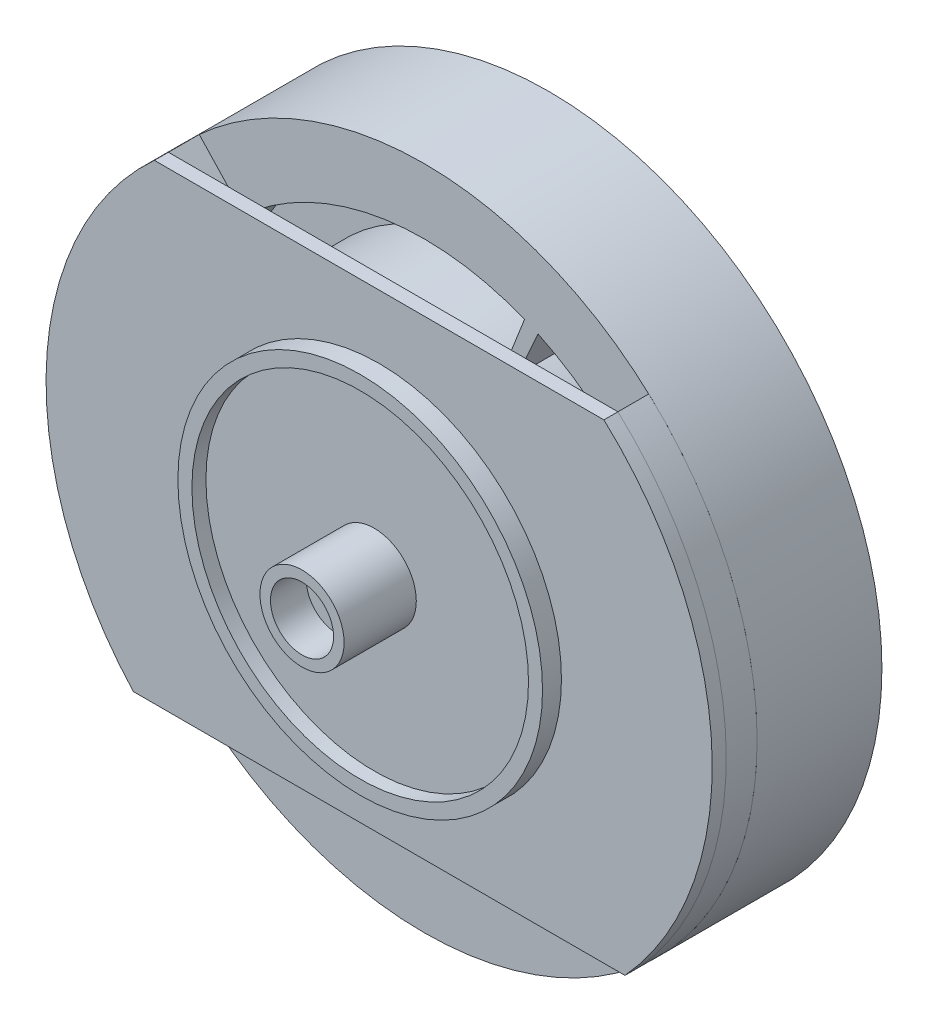
ISO-10303-21;
HEADER;
FILE_DESCRIPTION(('STEP AP214'),'2;1');
FILE_NAME('part.step','',(''),(''),'','','');
FILE_SCHEMA(('AUTOMOTIVE_DESIGN { 1 0 10303 214 1 1 1 1 }'));
ENDSEC;
DATA;
#1=APPLICATION_CONTEXT('core data for automotive mechanical design processes');
#2=APPLICATION_PROTOCOL_DEFINITION('international standard','automotive_design',2000,#1);
#3=PRODUCT_CONTEXT('',#1,'mechanical');
#4=PRODUCT('Part','Part','',(#3));
#5=PRODUCT_RELATED_PRODUCT_CATEGORY('part','',(#4));
#6=PRODUCT_DEFINITION_FORMATION('','',#4);
#7=PRODUCT_DEFINITION_CONTEXT('part definition',#1,'design');
#8=PRODUCT_DEFINITION('design','',#6,#7);
#9=PRODUCT_DEFINITION_SHAPE('','',#8);
#10=(LENGTH_UNIT() NAMED_UNIT(*) SI_UNIT(.MILLI.,.METRE.));
#11=(NAMED_UNIT(*) PLANE_ANGLE_UNIT() SI_UNIT($,.RADIAN.));
#12=(NAMED_UNIT(*) SI_UNIT($,.STERADIAN.) SOLID_ANGLE_UNIT());
#13=UNCERTAINTY_MEASURE_WITH_UNIT(LENGTH_MEASURE(1.E-05),#10,'distance_accuracy_value','');
#14=(GEOMETRIC_REPRESENTATION_CONTEXT(3) GLOBAL_UNCERTAINTY_ASSIGNED_CONTEXT((#13)) GLOBAL_UNIT_ASSIGNED_CONTEXT((#10,
#11,#12)) REPRESENTATION_CONTEXT('',''));
#15=CARTESIAN_POINT('',(0.,0.,0.));
#16=DIRECTION('',(0.,0.,1.));
#17=DIRECTION('',(1.,0.,0.));
#18=AXIS2_PLACEMENT_3D('',#15,#16,#17);
#19=CARTESIAN_POINT('',(-3.82843024285123,2.76033441316249,12.2448799994286));
#20=DIRECTION('',(0.,0.,-1.));
#21=DIRECTION('',(-1.,0.,0.));
#22=AXIS2_PLACEMENT_3D('',#19,#20,#21);
#23=CYLINDRICAL_SURFACE('',#22,23.75);
#24=CARTESIAN_POINT('',(-3.82843024285123,2.76033441316249,11.2448799994286));
#25=DIRECTION('',(0.,0.,1.));
#26=DIRECTION('',(1.,0.,0.));
#27=AXIS2_PLACEMENT_3D('',#24,#25,#26);
#28=CIRCLE('',#27,23.75);
#29=CARTESIAN_POINT('',(-19.8553375945632,20.2874773845552,11.2448799994286));
#30=VERTEX_POINT('',#29);
#31=CARTESIAN_POINT('',(-21.355573214244,-13.2665729385494,11.2448799994286));
#32=VERTEX_POINT('',#31);
#33=EDGE_CURVE('E119',#30,#32,#28,.T.);
#34=ORIENTED_EDGE('',*,*,#33,.T.);
#35=DIRECTION('',(0.,0.,-1.));
#36=VECTOR('',#35,1.);
#37=CARTESIAN_POINT('',(-21.355573214244,-13.2665729385494,12.2448799994286));
#38=LINE('',#37,#36);
#39=CARTESIAN_POINT('',(-21.355573214244,-13.2665729385494,12.2448799994286));
#40=VERTEX_POINT('',#39);
#41=EDGE_CURVE('E12',#40,#32,#38,.T.);
#42=ORIENTED_EDGE('',*,*,#41,.F.);
#43=CARTESIAN_POINT('',(-3.82843024285123,2.76033441316249,12.2448799994286));
#44=DIRECTION('',(0.,0.,1.));
#45=DIRECTION('',(1.,0.,0.));
#46=AXIS2_PLACEMENT_3D('',#43,#44,#45);
#47=CIRCLE('',#46,23.75);
#48=CARTESIAN_POINT('',(-19.8553375945632,20.2874773845552,12.2448799994286));
#49=VERTEX_POINT('',#48);
#50=EDGE_CURVE('E106',#49,#40,#47,.T.);
#51=ORIENTED_EDGE('',*,*,#50,.F.);
#52=DIRECTION('',(0.,0.,-1.));
#53=VECTOR('',#52,1.);
#54=CARTESIAN_POINT('',(-19.8553375945632,20.2874773845552,12.2448799994286));
#55=LINE('',#54,#53);
#56=EDGE_CURVE('E115',#49,#30,#55,.T.);
#57=ORIENTED_EDGE('',*,*,#56,.T.);
#58=EDGE_LOOP('',(#34,#42,#51,#57));
#59=FACE_BOUND('',#58,.T.);
#60=ADVANCED_FACE('F54',(#59),#23,.T.);
#61=CARTESIAN_POINT('',(-21.355573214244,-13.2665729385494,12.2448799994286));
#62=DIRECTION('',(0.,1.,0.));
#63=DIRECTION('',(0.,0.,1.));
#64=AXIS2_PLACEMENT_3D('',#61,#62,#63);
#65=PLANE('',#64);
#66=DIRECTION('',(1.,0.,0.));
#67=VECTOR('',#66,1.);
#68=CARTESIAN_POINT('',(-21.355573214244,-13.2665729385494,11.2448799994286));
#69=LINE('',#68,#67);
#70=CARTESIAN_POINT('',(13.6987127285415,-13.2665729385494,11.2448799994286));
#71=VERTEX_POINT('',#70);
#72=EDGE_CURVE('E110',#32,#71,#69,.T.);
#73=ORIENTED_EDGE('',*,*,#72,.T.);
#74=DIRECTION('',(0.,0.,-1.));
#75=VECTOR('',#74,1.);
#76=CARTESIAN_POINT('',(13.6987127285415,-13.2665729385494,12.2448799994286));
#77=LINE('',#76,#75);
#78=CARTESIAN_POINT('',(13.6987127285415,-13.2665729385494,12.2448799994286));
#79=VERTEX_POINT('',#78);
#80=EDGE_CURVE('E63',#79,#71,#77,.T.);
#81=ORIENTED_EDGE('',*,*,#80,.F.);
#82=DIRECTION('',(1.,0.,0.));
#83=VECTOR('',#82,1.);
#84=CARTESIAN_POINT('',(-21.355573214244,-13.2665729385494,12.2448799994286));
#85=LINE('',#84,#83);
#86=EDGE_CURVE('E101',#40,#79,#85,.T.);
#87=ORIENTED_EDGE('',*,*,#86,.F.);
#88=ORIENTED_EDGE('',*,*,#41,.T.);
#89=EDGE_LOOP('',(#73,#81,#87,#88));
#90=FACE_BOUND('',#89,.T.);
#91=ADVANCED_FACE('F109',(#90),#65,.F.);
#92=CARTESIAN_POINT('',(-3.82843024285123,2.76033441316249,12.2448799994286));
#93=DIRECTION('',(0.,0.,-1.));
#94=DIRECTION('',(-1.,0.,0.));
#95=AXIS2_PLACEMENT_3D('',#92,#93,#94);
#96=CYLINDRICAL_SURFACE('',#95,23.75);
#97=CARTESIAN_POINT('',(-3.82843024285123,2.76033441316249,11.2448799994286));
#98=DIRECTION('',(0.,0.,1.));
#99=DIRECTION('',(-1.,0.,0.));
#100=AXIS2_PLACEMENT_3D('',#97,#98,#99);
#101=CIRCLE('',#100,23.75);
#102=CARTESIAN_POINT('',(12.1984771088607,20.2874773845552,11.2448799994286));
#103=VERTEX_POINT('',#102);
#104=EDGE_CURVE('E88',#71,#103,#101,.T.);
#105=ORIENTED_EDGE('',*,*,#104,.T.);
#106=DIRECTION('',(0.,0.,-1.));
#107=VECTOR('',#106,1.);
#108=CARTESIAN_POINT('',(12.1984771088607,20.2874773845552,12.2448799994286));
#109=LINE('',#108,#107);
#110=CARTESIAN_POINT('',(12.1984771088607,20.2874773845552,12.2448799994286));
#111=VERTEX_POINT('',#110);
#112=EDGE_CURVE('E111',#111,#103,#109,.T.);
#113=ORIENTED_EDGE('',*,*,#112,.F.);
#114=CARTESIAN_POINT('',(-3.82843024285123,2.76033441316249,12.2448799994286));
#115=DIRECTION('',(0.,0.,1.));
#116=DIRECTION('',(-1.,0.,0.));
#117=AXIS2_PLACEMENT_3D('',#114,#115,#116);
#118=CIRCLE('',#117,23.75);
#119=EDGE_CURVE('E104',#79,#111,#118,.T.);
#120=ORIENTED_EDGE('',*,*,#119,.F.);
#121=ORIENTED_EDGE('',*,*,#80,.T.);
#122=EDGE_LOOP('',(#105,#113,#120,#121));
#123=FACE_BOUND('',#122,.T.);
#124=ADVANCED_FACE('F113',(#123),#96,.T.);
#125=CARTESIAN_POINT('',(-19.8553375945632,20.2874773845552,12.2448799994286));
#126=DIRECTION('',(0.,-1.,0.));
#127=DIRECTION('',(0.,0.,-1.));
#128=AXIS2_PLACEMENT_3D('',#125,#126,#127);
#129=PLANE('',#128);
#130=DIRECTION('',(-1.,0.,0.));
#131=VECTOR('',#130,1.);
#132=CARTESIAN_POINT('',(-19.8553375945632,20.2874773845552,11.2448799994286));
#133=LINE('',#132,#131);
#134=EDGE_CURVE('E94',#103,#30,#133,.T.);
#135=ORIENTED_EDGE('',*,*,#134,.T.);
#136=ORIENTED_EDGE('',*,*,#56,.F.);
#137=DIRECTION('',(-1.,0.,0.));
#138=VECTOR('',#137,1.);
#139=CARTESIAN_POINT('',(-19.8553375945632,20.2874773845552,12.2448799994286));
#140=LINE('',#139,#138);
#141=EDGE_CURVE('E71',#111,#49,#140,.T.);
#142=ORIENTED_EDGE('',*,*,#141,.F.);
#143=ORIENTED_EDGE('',*,*,#112,.T.);
#144=EDGE_LOOP('',(#135,#136,#142,#143));
#145=FACE_BOUND('',#144,.T.);
#146=ADVANCED_FACE('F127',(#145),#129,.F.);
#147=CARTESIAN_POINT('',(-3.82843024285123,2.76033441316249,12.2448799994286));
#148=DIRECTION('',(0.,0.,1.));
#149=DIRECTION('',(1.,0.,0.));
#150=AXIS2_PLACEMENT_3D('',#147,#148,#149);
#151=PLANE('',#150);
#152=CARTESIAN_POINT('',(-3.82843024285123,2.76033441316249,12.2448799994286));
#153=DIRECTION('',(0.,0.,1.));
#154=DIRECTION('',(1.,0.,0.));
#155=AXIS2_PLACEMENT_3D('',#152,#153,#154);
#156=CIRCLE('',#155,13.);
#157=CARTESIAN_POINT('',(-16.8284302428512,2.76033441316249,12.2448799994286));
#158=VERTEX_POINT('',#157);
#159=EDGE_CURVE('E135',#158,#158,#156,.T.);
#160=ORIENTED_EDGE('',*,*,#159,.F.);
#161=EDGE_LOOP('',(#160));
#162=FACE_BOUND('',#161,.T.);
#163=ORIENTED_EDGE('',*,*,#50,.T.);
#164=ORIENTED_EDGE('',*,*,#86,.T.);
#165=ORIENTED_EDGE('',*,*,#119,.T.);
#166=ORIENTED_EDGE('',*,*,#141,.T.);
#167=EDGE_LOOP('',(#163,#164,#165,#166));
#168=FACE_BOUND('',#167,.T.);
#169=ADVANCED_FACE('F102',(#162,#168),#151,.T.);
#170=CARTESIAN_POINT('',(-3.82843024285123,2.76033441316249,11.2448799994286));
#171=DIRECTION('',(0.,0.,1.));
#172=DIRECTION('',(1.,0.,0.));
#173=AXIS2_PLACEMENT_3D('',#170,#171,#172);
#174=PLANE('',#173);
#175=ORIENTED_EDGE('',*,*,#33,.F.);
#176=ORIENTED_EDGE('',*,*,#134,.F.);
#177=ORIENTED_EDGE('',*,*,#104,.F.);
#178=ORIENTED_EDGE('',*,*,#72,.F.);
#179=EDGE_LOOP('',(#175,#176,#177,#178));
#180=FACE_BOUND('',#179,.T.);
#181=ADVANCED_FACE('F130',(#180),#174,.F.);
#182=CARTESIAN_POINT('',(-3.82843024285123,2.76033441316249,13.5948799994286));
#183=DIRECTION('',(0.,0.,-1.));
#184=DIRECTION('',(-1.,0.,0.));
#185=AXIS2_PLACEMENT_3D('',#182,#183,#184);
#186=CYLINDRICAL_SURFACE('',#185,13.);
#187=CARTESIAN_POINT('',(-3.82843024285123,2.76033441316249,13.5948799994286));
#188=DIRECTION('',(0.,0.,1.));
#189=DIRECTION('',(1.,0.,0.));
#190=AXIS2_PLACEMENT_3D('',#187,#188,#189);
#191=CIRCLE('',#190,13.);
#192=CARTESIAN_POINT('',(-16.8284302428512,2.76033441316249,13.5948799994286));
#193=VERTEX_POINT('',#192);
#194=EDGE_CURVE('E138',#193,#193,#191,.T.);
#195=CARTESIAN_POINT('',(-16.8284302428512,2.76033441316249,13.5948799994286));
#196=CARTESIAN_POINT('',(-16.8284302428512,2.76033441316249,13.5808174994286));
#197=CARTESIAN_POINT('',(-16.8284302428512,2.76033441316249,13.5667549994286));
#198=CARTESIAN_POINT('',(-16.8284302428512,2.76033441316249,13.5386299994286));
#199=CARTESIAN_POINT('',(-16.8284302428512,2.76033441316249,13.5245674994286));
#200=CARTESIAN_POINT('',(-16.8284302428512,2.76033441316249,13.4964424994286));
#201=CARTESIAN_POINT('',(-16.8284302428512,2.76033441316249,13.4823799994286));
#202=CARTESIAN_POINT('',(-16.8284302428512,2.76033441316249,13.4542549994286));
#203=CARTESIAN_POINT('',(-16.8284302428512,2.76033441316249,13.4401924994286));
#204=CARTESIAN_POINT('',(-16.8284302428512,2.76033441316249,13.4120674994286));
#205=CARTESIAN_POINT('',(-16.8284302428512,2.76033441316249,13.3980049994286));
#206=CARTESIAN_POINT('',(-16.8284302428512,2.76033441316249,13.3698799994286));
#207=CARTESIAN_POINT('',(-16.8284302428512,2.76033441316249,13.3558174994286));
#208=CARTESIAN_POINT('',(-16.8284302428512,2.76033441316249,13.3276924994286));
#209=CARTESIAN_POINT('',(-16.8284302428512,2.76033441316249,13.3136299994286));
#210=CARTESIAN_POINT('',(-16.8284302428512,2.76033441316249,13.2855049994286));
#211=CARTESIAN_POINT('',(-16.8284302428512,2.76033441316249,13.2714424994286));
#212=CARTESIAN_POINT('',(-16.8284302428512,2.76033441316249,13.2433174994286));
#213=CARTESIAN_POINT('',(-16.8284302428512,2.76033441316249,13.2292549994286));
#214=CARTESIAN_POINT('',(-16.8284302428512,2.76033441316249,13.2011299994286));
#215=CARTESIAN_POINT('',(-16.8284302428512,2.76033441316249,13.1870674994286));
#216=CARTESIAN_POINT('',(-16.8284302428512,2.76033441316249,13.1589424994286));
#217=CARTESIAN_POINT('',(-16.8284302428512,2.76033441316249,13.1448799994286));
#218=CARTESIAN_POINT('',(-16.8284302428512,2.76033441316249,13.1167549994286));
#219=CARTESIAN_POINT('',(-16.8284302428512,2.76033441316249,13.1026924994286));
#220=CARTESIAN_POINT('',(-16.8284302428512,2.76033441316249,13.0745674994286));
#221=CARTESIAN_POINT('',(-16.8284302428512,2.76033441316249,13.0605049994286));
#222=CARTESIAN_POINT('',(-16.8284302428512,2.76033441316249,13.0323799994286));
#223=CARTESIAN_POINT('',(-16.8284302428512,2.76033441316249,13.0183174994286));
#224=CARTESIAN_POINT('',(-16.8284302428512,2.76033441316249,12.9901924994286));
#225=CARTESIAN_POINT('',(-16.8284302428512,2.76033441316249,12.9761299994286));
#226=CARTESIAN_POINT('',(-16.8284302428512,2.76033441316249,12.9480049994286));
#227=CARTESIAN_POINT('',(-16.8284302428512,2.76033441316249,12.9339424994286));
#228=CARTESIAN_POINT('',(-16.8284302428512,2.76033441316249,12.9058174994286));
#229=CARTESIAN_POINT('',(-16.8284302428512,2.76033441316249,12.8917549994286));
#230=CARTESIAN_POINT('',(-16.8284302428512,2.76033441316249,12.8636299994286));
#231=CARTESIAN_POINT('',(-16.8284302428512,2.76033441316249,12.8495674994286));
#232=CARTESIAN_POINT('',(-16.8284302428512,2.76033441316249,12.8214424994286));
#233=CARTESIAN_POINT('',(-16.8284302428512,2.76033441316249,12.8073799994286));
#234=CARTESIAN_POINT('',(-16.8284302428512,2.76033441316249,12.7792549994286));
#235=CARTESIAN_POINT('',(-16.8284302428512,2.76033441316249,12.7651924994286));
#236=CARTESIAN_POINT('',(-16.8284302428512,2.76033441316249,12.7370674994286));
#237=CARTESIAN_POINT('',(-16.8284302428512,2.76033441316249,12.7230049994286));
#238=CARTESIAN_POINT('',(-16.8284302428512,2.76033441316249,12.6948799994286));
#239=CARTESIAN_POINT('',(-16.8284302428512,2.76033441316249,12.6808174994286));
#240=CARTESIAN_POINT('',(-16.8284302428512,2.76033441316249,12.6526924994286));
#241=CARTESIAN_POINT('',(-16.8284302428512,2.76033441316249,12.6386299994286));
#242=CARTESIAN_POINT('',(-16.8284302428512,2.76033441316249,12.6105049994286));
#243=CARTESIAN_POINT('',(-16.8284302428512,2.76033441316249,12.5964424994286));
#244=CARTESIAN_POINT('',(-16.8284302428512,2.76033441316249,12.5683174994286));
#245=CARTESIAN_POINT('',(-16.8284302428512,2.76033441316249,12.5542549994286));
#246=CARTESIAN_POINT('',(-16.8284302428512,2.76033441316249,12.5261299994286));
#247=CARTESIAN_POINT('',(-16.8284302428512,2.76033441316249,12.5120674994286));
#248=CARTESIAN_POINT('',(-16.8284302428512,2.76033441316249,12.4839424994286));
#249=CARTESIAN_POINT('',(-16.8284302428512,2.76033441316249,12.4698799994286));
#250=CARTESIAN_POINT('',(-16.8284302428512,2.76033441316249,12.4417549994286));
#251=CARTESIAN_POINT('',(-16.8284302428512,2.76033441316249,12.4276924994286));
#252=CARTESIAN_POINT('',(-16.8284302428512,2.76033441316249,12.3995674994286));
#253=CARTESIAN_POINT('',(-16.8284302428512,2.76033441316249,12.3855049994286));
#254=CARTESIAN_POINT('',(-16.8284302428512,2.76033441316249,12.3573799994286));
#255=CARTESIAN_POINT('',(-16.8284302428512,2.76033441316249,12.3433174994286));
#256=CARTESIAN_POINT('',(-16.8284302428512,2.76033441316249,12.3151924994286));
#257=CARTESIAN_POINT('',(-16.8284302428512,2.76033441316249,12.3011299994286));
#258=CARTESIAN_POINT('',(-16.8284302428512,2.76033441316249,12.2730049994286));
#259=CARTESIAN_POINT('',(-16.8284302428512,2.76033441316249,12.2589424994286));
#260=CARTESIAN_POINT('',(-16.8284302428512,2.76033441316249,12.2448799994286));
#261=B_SPLINE_CURVE_WITH_KNOTS('',3,(#195,#196,#197,#198,#199,#200,#201,#202,#203,#204,#205,
#206,#207,#208,#209,#210,#211,#212,#213,#214,#215,#216,#217,#218,#219,#220,#221,#222,#223,#224,
#225,#226,#227,#228,#229,#230,#231,#232,#233,#234,#235,#236,#237,#238,#239,#240,#241,#242,#243,
#244,#245,#246,#247,#248,#249,#250,#251,#252,#253,#254,#255,#256,#257,#258,#259,#260),
.UNSPECIFIED.,.F.,.F.,(4,2,2,2,2,2,2,2,2,2,2,2,2,2,2,2,2,2,2,2,2,2,2,2,2,2,2,2,2,2,2,2,4),(0.,
0.0421875000000006,0.0843750000000011,0.126562500000002,0.168750000000001,0.210937500000001,
0.253125000000002,0.2953125,0.337500000000001,0.379687500000002,0.421875,0.464062500000001,
0.506250000000002,0.548437500000002,0.590625000000001,0.632812500000001,0.675000000000002,
0.717187500000001,0.759375000000001,0.801562500000002,0.843750000000001,0.885937500000001,
0.928125000000002,0.970312500000001,1.0125,1.0546875,1.096875,1.1390625,1.18125,1.2234375,
1.265625,1.3078125,1.35),.UNSPECIFIED.);
#262=EDGE_CURVE('BSEAM189',#193,#158,#261,.T.);
#263=ORIENTED_EDGE('',*,*,#194,.F.);
#264=ORIENTED_EDGE('',*,*,#159,.T.);
#265=ORIENTED_EDGE('',*,*,#262,.T.);
#266=ORIENTED_EDGE('',*,*,#262,.F.);
#267=EDGE_LOOP('',(#263,#265,#264,#266));
#268=FACE_BOUND('',#267,.T.);
#269=ADVANCED_FACE('F189',(#268),#186,.T.);
#270=CARTESIAN_POINT('',(-3.82843024285123,2.76033441316249,13.5948799994286));
#271=DIRECTION('',(0.,0.,1.));
#272=DIRECTION('',(1.,0.,0.));
#273=AXIS2_PLACEMENT_3D('',#270,#271,#272);
#274=PLANE('',#273);
#275=CARTESIAN_POINT('',(-3.82843024285123,2.76033441316249,13.5948799994286));
#276=DIRECTION('',(0.,0.,1.));
#277=DIRECTION('',(1.,0.,0.));
#278=AXIS2_PLACEMENT_3D('',#275,#276,#277);
#279=CIRCLE('',#278,12.);
#280=CARTESIAN_POINT('',(8.17156975714877,2.76033441316249,13.5948799994286));
#281=VERTEX_POINT('',#280);
#282=EDGE_CURVE('E142',#281,#281,#279,.T.);
#283=ORIENTED_EDGE('',*,*,#282,.F.);
#284=EDGE_LOOP('',(#283));
#285=FACE_BOUND('',#284,.T.);
#286=ORIENTED_EDGE('',*,*,#194,.T.);
#287=EDGE_LOOP('',(#286));
#288=FACE_BOUND('',#287,.T.);
#289=ADVANCED_FACE('F197',(#285,#288),#274,.T.);
#290=CARTESIAN_POINT('',(-3.82843024285123,2.76033441316249,12.5948799994286));
#291=DIRECTION('',(0.,0.,1.));
#292=DIRECTION('',(1.,0.,0.));
#293=AXIS2_PLACEMENT_3D('',#290,#291,#292);
#294=CYLINDRICAL_SURFACE('',#293,12.);
#295=CARTESIAN_POINT('',(-3.82843024285123,2.76033441316249,12.5948799994286));
#296=DIRECTION('',(0.,0.,1.));
#297=DIRECTION('',(1.,0.,0.));
#298=AXIS2_PLACEMENT_3D('',#295,#296,#297);
#299=CIRCLE('',#298,12.);
#300=CARTESIAN_POINT('',(8.17156975714877,2.76033441316249,12.5948799994286));
#301=VERTEX_POINT('',#300);
#302=EDGE_CURVE('E139',#301,#301,#299,.T.);
#303=ORIENTED_EDGE('',*,*,#302,.F.);
#304=EDGE_LOOP('',(#303));
#305=FACE_BOUND('',#304,.T.);
#306=ORIENTED_EDGE('',*,*,#282,.T.);
#307=EDGE_LOOP('',(#306));
#308=FACE_BOUND('',#307,.T.);
#309=ADVANCED_FACE('F203',(#305,#308),#294,.F.);
#310=CARTESIAN_POINT('',(-3.82843024285123,2.76033441316249,12.5948799994286));
#311=DIRECTION('',(0.,0.,1.));
#312=DIRECTION('',(1.,0.,0.));
#313=AXIS2_PLACEMENT_3D('',#310,#311,#312);
#314=PLANE('',#313);
#315=CARTESIAN_POINT('',(-3.82843024285123,2.76033441316249,12.5948799994286));
#316=DIRECTION('',(0.,0.,1.));
#317=DIRECTION('',(1.,0.,0.));
#318=AXIS2_PLACEMENT_3D('',#315,#316,#317);
#319=CIRCLE('',#318,3.);
#320=CARTESIAN_POINT('',(-0.828430242851232,2.76033441316249,12.5948799994286));
#321=VERTEX_POINT('',#320);
#322=EDGE_CURVE('E57',#321,#321,#319,.T.);
#323=ORIENTED_EDGE('',*,*,#322,.F.);
#324=EDGE_LOOP('',(#323));
#325=FACE_BOUND('',#324,.T.);
#326=ORIENTED_EDGE('',*,*,#302,.T.);
#327=EDGE_LOOP('',(#326));
#328=FACE_BOUND('',#327,.T.);
#329=ADVANCED_FACE('F166',(#325,#328),#314,.T.);
#330=CARTESIAN_POINT('',(-3.82843024285123,2.76033441316249,17.7448799994286));
#331=DIRECTION('',(0.,0.,1.));
#332=DIRECTION('',(1.,0.,0.));
#333=AXIS2_PLACEMENT_3D('',#330,#331,#332);
#334=PLANE('',#333);
#335=CARTESIAN_POINT('',(-3.82843024285123,2.76033441316249,17.7448799994286));
#336=DIRECTION('',(0.,0.,1.));
#337=DIRECTION('',(1.,0.,0.));
#338=AXIS2_PLACEMENT_3D('',#335,#336,#337);
#339=CIRCLE('',#338,2.25);
#340=CARTESIAN_POINT('',(-1.57843024285123,2.76033441316249,17.7448799994286));
#341=VERTEX_POINT('',#340);
#342=EDGE_CURVE('E148',#341,#341,#339,.T.);
#343=ORIENTED_EDGE('',*,*,#342,.F.);
#344=EDGE_LOOP('',(#343));
#345=FACE_BOUND('',#344,.T.);
#346=CARTESIAN_POINT('',(-3.82843024285123,2.76033441316249,17.7448799994286));
#347=DIRECTION('',(0.,0.,1.));
#348=DIRECTION('',(1.,0.,0.));
#349=AXIS2_PLACEMENT_3D('',#346,#347,#348);
#350=CIRCLE('',#349,3.);
#351=CARTESIAN_POINT('',(-0.828430242851232,2.76033441316249,17.7448799994286));
#352=VERTEX_POINT('',#351);
#353=EDGE_CURVE('E122',#352,#352,#350,.T.);
#354=ORIENTED_EDGE('',*,*,#353,.T.);
#355=EDGE_LOOP('',(#354));
#356=FACE_BOUND('',#355,.T.);
#357=ADVANCED_FACE('F163',(#345,#356),#334,.T.);
#358=CARTESIAN_POINT('',(-3.82843024285123,2.76033441316249,17.7448799994286));
#359=DIRECTION('',(0.,0.,-1.));
#360=DIRECTION('',(-1.,0.,0.));
#361=AXIS2_PLACEMENT_3D('',#358,#359,#360);
#362=CYLINDRICAL_SURFACE('',#361,3.);
#363=ORIENTED_EDGE('',*,*,#322,.T.);
#364=EDGE_LOOP('',(#363));
#365=FACE_BOUND('',#364,.T.);
#366=ORIENTED_EDGE('',*,*,#353,.F.);
#367=EDGE_LOOP('',(#366));
#368=FACE_BOUND('',#367,.T.);
#369=ADVANCED_FACE('F159',(#365,#368),#362,.T.);
#370=CARTESIAN_POINT('',(-3.82843024285123,2.76033441316249,15.1948799994286));
#371=DIRECTION('',(0.,0.,1.));
#372=DIRECTION('',(1.,0.,0.));
#373=AXIS2_PLACEMENT_3D('',#370,#371,#372);
#374=CYLINDRICAL_SURFACE('',#373,2.25);
#375=CARTESIAN_POINT('',(-3.82843024285123,2.76033441316249,15.1948799994286));
#376=DIRECTION('',(0.,0.,1.));
#377=DIRECTION('',(1.,0.,0.));
#378=AXIS2_PLACEMENT_3D('',#375,#376,#377);
#379=CIRCLE('',#378,2.25);
#380=CARTESIAN_POINT('',(-1.57843024285123,2.76033441316249,15.1948799994286));
#381=VERTEX_POINT('',#380);
#382=EDGE_CURVE('E145',#381,#381,#379,.T.);
#383=ORIENTED_EDGE('',*,*,#382,.F.);
#384=EDGE_LOOP('',(#383));
#385=FACE_BOUND('',#384,.T.);
#386=ORIENTED_EDGE('',*,*,#342,.T.);
#387=EDGE_LOOP('',(#386));
#388=FACE_BOUND('',#387,.T.);
#389=ADVANCED_FACE('F156',(#385,#388),#374,.F.);
#390=CARTESIAN_POINT('',(-3.82843024285123,2.76033441316249,15.1948799994286));
#391=DIRECTION('',(0.,0.,1.));
#392=DIRECTION('',(1.,0.,0.));
#393=AXIS2_PLACEMENT_3D('',#390,#391,#392);
#394=PLANE('',#393);
#395=ORIENTED_EDGE('',*,*,#382,.T.);
#396=EDGE_LOOP('',(#395));
#397=FACE_BOUND('',#396,.T.);
#398=ADVANCED_FACE('F154',(#397),#394,.T.);
#399=CLOSED_SHELL('',(#60,#91,#124,#146,#169,#181,#269,#289,#309,#329,#357,#369,#389,#398));
#400=MANIFOLD_SOLID_BREP('B2',#399);
#401=CARTESIAN_POINT('',(-3.82843024285123,2.76033441316249,9.04487999942864));
#402=DIRECTION('',(0.,0.,1.));
#403=DIRECTION('',(1.,0.,0.));
#404=AXIS2_PLACEMENT_3D('',#401,#402,#403);
#405=PLANE('',#404);
#406=CARTESIAN_POINT('',(-3.82843024285123,2.76033441316249,9.04487999942864));
#407=DIRECTION('',(0.,0.,-1.));
#408=DIRECTION('',(1.,0.,0.));
#409=AXIS2_PLACEMENT_3D('',#406,#407,#408);
#410=CIRCLE('',#409,19.1);
#411=CARTESIAN_POINT('',(-17.9579810626889,-10.0913500534599,9.04487999942864));
#412=VERTEX_POINT('',#411);
#413=CARTESIAN_POINT('',(-16.6801147094736,16.8898852330002,9.04487999942864));
#414=VERTEX_POINT('',#413);
#415=EDGE_CURVE('E52',#412,#414,#410,.T.);
#416=ORIENTED_EDGE('',*,*,#415,.F.);
#417=DIRECTION('',(0.730611377314205,0.682793537856825,0.));
#418=VECTOR('',#417,1.);
#419=CARTESIAN_POINT('',(-21.355573214244,-13.2665729385494,9.04487999942864));
#420=LINE('',#419,#418);
#421=CARTESIAN_POINT('',(-21.355573214244,-13.2665729385494,9.04487999942864));
#422=VERTEX_POINT('',#421);
#423=EDGE_CURVE('E399',#422,#412,#420,.T.);
#424=ORIENTED_EDGE('',*,*,#423,.F.);
#425=CARTESIAN_POINT('',(-3.82843024285123,2.76033441316249,9.04487999942864));
#426=DIRECTION('',(0.,0.,1.));
#427=DIRECTION('',(1.,0.,0.));
#428=AXIS2_PLACEMENT_3D('',#425,#426,#427);
#429=CIRCLE('',#428,23.75);
#430=CARTESIAN_POINT('',(-19.8553375945632,20.2874773845552,9.04487999942864));
#431=VERTEX_POINT('',#430);
#432=EDGE_CURVE('E402',#431,#422,#429,.T.);
#433=ORIENTED_EDGE('',*,*,#432,.F.);
#434=DIRECTION('',(-0.682793537856825,0.730611377314205,0.));
#435=VECTOR('',#434,1.);
#436=CARTESIAN_POINT('',(-16.6801147094736,16.8898852330002,9.04487999942864));
#437=LINE('',#436,#435);
#438=EDGE_CURVE('E345',#414,#431,#437,.T.);
#439=ORIENTED_EDGE('',*,*,#438,.F.);
#440=EDGE_LOOP('',(#416,#424,#433,#439));
#441=FACE_BOUND('',#440,.T.);
#442=ADVANCED_FACE('F336',(#441),#405,.F.);
#443=CARTESIAN_POINT('',(-21.355573214244,-13.2665729385494,47.2244431281084));
#444=DIRECTION('',(-0.682793537856825,0.730611377314205,0.));
#445=DIRECTION('',(-0.730611377314205,-0.682793537856825,0.));
#446=AXIS2_PLACEMENT_3D('',#443,#444,#445);
#447=PLANE('',#446);
#448=DIRECTION('',(0.,0.,-1.));
#449=VECTOR('',#448,1.);
#450=CARTESIAN_POINT('',(-17.9579810626889,-10.0913500534599,47.2244431281084));
#451=LINE('',#450,#449);
#452=CARTESIAN_POINT('',(-17.9579810626889,-10.0913500534599,11.2448799994286));
#453=VERTEX_POINT('',#452);
#454=EDGE_CURVE('E397',#453,#412,#451,.T.);
#455=ORIENTED_EDGE('',*,*,#454,.F.);
#456=DIRECTION('',(-0.730611377314205,-0.682793537856825,0.));
#457=VECTOR('',#456,1.);
#458=CARTESIAN_POINT('',(-21.355573214244,-13.2665729385494,11.2448799994286));
#459=LINE('',#458,#457);
#460=CARTESIAN_POINT('',(-21.355573214244,-13.2665729385494,11.2448799994286));
#461=VERTEX_POINT('',#460);
#462=EDGE_CURVE('E390',#453,#461,#459,.T.);
#463=ORIENTED_EDGE('',*,*,#462,.T.);
#464=DIRECTION('',(0.,0.,-1.));
#465=VECTOR('',#464,1.);
#466=CARTESIAN_POINT('',(-21.355573214244,-13.2665729385494,47.2244431281084));
#467=LINE('',#466,#465);
#468=EDGE_CURVE('E386',#461,#422,#467,.T.);
#469=ORIENTED_EDGE('',*,*,#468,.T.);
#470=ORIENTED_EDGE('',*,*,#423,.T.);
#471=EDGE_LOOP('',(#455,#463,#469,#470));
#472=FACE_BOUND('',#471,.T.);
#473=ADVANCED_FACE('F407',(#472),#447,.F.);
#474=CARTESIAN_POINT('',(-3.82843024285123,2.76033441316249,47.2244431281084));
#475=DIRECTION('',(0.,0.,-1.));
#476=DIRECTION('',(-1.,0.,0.));
#477=AXIS2_PLACEMENT_3D('',#474,#475,#476);
#478=CYLINDRICAL_SURFACE('',#477,23.75);
#479=ORIENTED_EDGE('',*,*,#468,.F.);
#480=CARTESIAN_POINT('',(-3.82843024285123,2.76033441316249,11.2448799994286));
#481=DIRECTION('',(0.,0.,-1.));
#482=DIRECTION('',(-1.,0.,0.));
#483=AXIS2_PLACEMENT_3D('',#480,#481,#482);
#484=CIRCLE('',#483,23.75);
#485=CARTESIAN_POINT('',(-19.8553375945632,20.2874773845552,11.2448799994286));
#486=VERTEX_POINT('',#485);
#487=EDGE_CURVE('E340',#461,#486,#484,.T.);
#488=ORIENTED_EDGE('',*,*,#487,.T.);
#489=DIRECTION('',(0.,0.,-1.));
#490=VECTOR('',#489,1.);
#491=CARTESIAN_POINT('',(-19.8553375945632,20.2874773845552,47.2244431281084));
#492=LINE('',#491,#490);
#493=EDGE_CURVE('E361',#486,#431,#492,.T.);
#494=ORIENTED_EDGE('',*,*,#493,.T.);
#495=ORIENTED_EDGE('',*,*,#432,.T.);
#496=EDGE_LOOP('',(#479,#488,#494,#495));
#497=FACE_BOUND('',#496,.T.);
#498=ADVANCED_FACE('F388',(#497),#478,.T.);
#499=CARTESIAN_POINT('',(-16.6801147094736,16.8898852330002,47.2244431281084));
#500=DIRECTION('',(-0.730611377314205,-0.682793537856825,0.));
#501=DIRECTION('',(0.682793537856825,-0.730611377314205,0.));
#502=AXIS2_PLACEMENT_3D('',#499,#500,#501);
#503=PLANE('',#502);
#504=ORIENTED_EDGE('',*,*,#493,.F.);
#505=DIRECTION('',(0.682793537856825,-0.730611377314205,0.));
#506=VECTOR('',#505,1.);
#507=CARTESIAN_POINT('',(-16.6801147094736,16.8898852330002,11.2448799994286));
#508=LINE('',#507,#506);
#509=CARTESIAN_POINT('',(-16.6801147094736,16.8898852330002,11.2448799994286));
#510=VERTEX_POINT('',#509);
#511=EDGE_CURVE('E380',#486,#510,#508,.T.);
#512=ORIENTED_EDGE('',*,*,#511,.T.);
#513=DIRECTION('',(0.,0.,-1.));
#514=VECTOR('',#513,1.);
#515=CARTESIAN_POINT('',(-16.6801147094736,16.8898852330002,47.2244431281084));
#516=LINE('',#515,#514);
#517=EDGE_CURVE('E353',#510,#414,#516,.T.);
#518=ORIENTED_EDGE('',*,*,#517,.T.);
#519=ORIENTED_EDGE('',*,*,#438,.T.);
#520=EDGE_LOOP('',(#504,#512,#518,#519));
#521=FACE_BOUND('',#520,.T.);
#522=ADVANCED_FACE('F384',(#521),#503,.F.);
#523=CARTESIAN_POINT('',(-3.82843024285123,2.76033441316249,47.2244431281084));
#524=DIRECTION('',(0.,0.,-1.));
#525=DIRECTION('',(-1.,0.,0.));
#526=AXIS2_PLACEMENT_3D('',#523,#524,#525);
#527=CYLINDRICAL_SURFACE('',#526,19.1);
#528=ORIENTED_EDGE('',*,*,#517,.F.);
#529=CARTESIAN_POINT('',(-3.82843024285123,2.76033441316249,11.2448799994286));
#530=DIRECTION('',(0.,0.,-1.));
#531=DIRECTION('',(-1.,0.,0.));
#532=AXIS2_PLACEMENT_3D('',#529,#530,#531);
#533=CIRCLE('',#532,19.1);
#534=EDGE_CURVE('E383',#510,#453,#533,.F.);
#535=ORIENTED_EDGE('',*,*,#534,.T.);
#536=ORIENTED_EDGE('',*,*,#454,.T.);
#537=ORIENTED_EDGE('',*,*,#415,.T.);
#538=EDGE_LOOP('',(#528,#535,#536,#537));
#539=FACE_BOUND('',#538,.T.);
#540=ADVANCED_FACE('F406',(#539),#527,.F.);
#541=CARTESIAN_POINT('',(-3.82843024285123,2.76033441316249,11.2448799994286));
#542=DIRECTION('',(0.,0.,-1.));
#543=DIRECTION('',(-1.,0.,0.));
#544=AXIS2_PLACEMENT_3D('',#541,#542,#543);
#545=PLANE('',#544);
#546=ORIENTED_EDGE('',*,*,#511,.F.);
#547=ORIENTED_EDGE('',*,*,#487,.F.);
#548=ORIENTED_EDGE('',*,*,#462,.F.);
#549=ORIENTED_EDGE('',*,*,#534,.F.);
#550=EDGE_LOOP('',(#546,#547,#548,#549));
#551=FACE_BOUND('',#550,.T.);
#552=ADVANCED_FACE('F338',(#551),#545,.F.);
#553=CLOSED_SHELL('',(#442,#473,#498,#522,#540,#552));
#554=MANIFOLD_SOLID_BREP('B6',#553);
#555=CARTESIAN_POINT('',(-3.82843024285123,2.76033441316249,9.04487999942864));
#556=DIRECTION('',(0.,0.,-1.));
#557=DIRECTION('',(-1.,0.,0.));
#558=AXIS2_PLACEMENT_3D('',#555,#556,#557);
#559=PLANE('',#558);
#560=CARTESIAN_POINT('',(-3.82843024285123,2.76033441316249,9.04487999942864));
#561=DIRECTION('',(0.,0.,-1.));
#562=DIRECTION('',(-1.,0.,0.));
#563=AXIS2_PLACEMENT_3D('',#560,#561,#562);
#564=CIRCLE('',#563,19.1);
#565=CARTESIAN_POINT('',(9.02325422377115,16.8898852330002,9.04487999942864));
#566=VERTEX_POINT('',#565);
#567=CARTESIAN_POINT('',(10.3011205769865,-10.0913500534599,9.04487999942864));
#568=VERTEX_POINT('',#567);
#569=EDGE_CURVE('E532',#566,#568,#564,.T.);
#570=ORIENTED_EDGE('',*,*,#569,.F.);
#571=DIRECTION('',(-0.682793537856827,-0.730611377314204,0.));
#572=VECTOR('',#571,1.);
#573=CARTESIAN_POINT('',(9.02325422377115,16.8898852330002,9.04487999942864));
#574=LINE('',#573,#572);
#575=CARTESIAN_POINT('',(12.1984771088607,20.2874773845552,9.04487999942864));
#576=VERTEX_POINT('',#575);
#577=EDGE_CURVE('E543',#576,#566,#574,.T.);
#578=ORIENTED_EDGE('',*,*,#577,.F.);
#579=CARTESIAN_POINT('',(-3.82843024285123,2.76033441316249,9.04487999942864));
#580=DIRECTION('',(0.,0.,1.));
#581=DIRECTION('',(1.,0.,0.));
#582=AXIS2_PLACEMENT_3D('',#579,#580,#581);
#583=CIRCLE('',#582,23.75);
#584=CARTESIAN_POINT('',(13.6987127285415,-13.2665729385494,9.04487999942864));
#585=VERTEX_POINT('',#584);
#586=EDGE_CURVE('E534',#585,#576,#583,.T.);
#587=ORIENTED_EDGE('',*,*,#586,.F.);
#588=DIRECTION('',(0.730611377314204,-0.682793537856827,0.));
#589=VECTOR('',#588,1.);
#590=CARTESIAN_POINT('',(13.6987127285415,-13.2665729385494,9.04487999942864));
#591=LINE('',#590,#589);
#592=EDGE_CURVE('E524',#568,#585,#591,.T.);
#593=ORIENTED_EDGE('',*,*,#592,.F.);
#594=EDGE_LOOP('',(#570,#578,#587,#593));
#595=FACE_BOUND('',#594,.T.);
#596=ADVANCED_FACE('F482',(#595),#559,.T.);
#597=CARTESIAN_POINT('',(9.02325422377115,16.8898852330002,47.2244431281084));
#598=DIRECTION('',(0.730611377314204,-0.682793537856827,0.));
#599=DIRECTION('',(0.682793537856827,0.730611377314204,0.));
#600=AXIS2_PLACEMENT_3D('',#597,#598,#599);
#601=PLANE('',#600);
#602=DIRECTION('',(0.,0.,-1.));
#603=VECTOR('',#602,1.);
#604=CARTESIAN_POINT('',(9.02325422377115,16.8898852330002,47.2244431281084));
#605=LINE('',#604,#603);
#606=CARTESIAN_POINT('',(9.02325422377115,16.8898852330002,11.2448799994286));
#607=VERTEX_POINT('',#606);
#608=EDGE_CURVE('E537',#607,#566,#605,.T.);
#609=ORIENTED_EDGE('',*,*,#608,.F.);
#610=DIRECTION('',(0.682793537856827,0.730611377314204,0.));
#611=VECTOR('',#610,1.);
#612=CARTESIAN_POINT('',(9.02325422377115,16.8898852330002,11.2448799994286));
#613=LINE('',#612,#611);
#614=CARTESIAN_POINT('',(12.1984771088607,20.2874773845552,11.2448799994286));
#615=VERTEX_POINT('',#614);
#616=EDGE_CURVE('E486',#607,#615,#613,.T.);
#617=ORIENTED_EDGE('',*,*,#616,.T.);
#618=DIRECTION('',(0.,0.,-1.));
#619=VECTOR('',#618,1.);
#620=CARTESIAN_POINT('',(12.1984771088607,20.2874773845552,47.2244431281084));
#621=LINE('',#620,#619);
#622=EDGE_CURVE('E546',#615,#576,#621,.T.);
#623=ORIENTED_EDGE('',*,*,#622,.T.);
#624=ORIENTED_EDGE('',*,*,#577,.T.);
#625=EDGE_LOOP('',(#609,#617,#623,#624));
#626=FACE_BOUND('',#625,.T.);
#627=ADVANCED_FACE('F555',(#626),#601,.F.);
#628=CARTESIAN_POINT('',(-3.82843024285123,2.76033441316249,47.2244431281084));
#629=DIRECTION('',(0.,0.,-1.));
#630=DIRECTION('',(-1.,0.,0.));
#631=AXIS2_PLACEMENT_3D('',#628,#629,#630);
#632=CYLINDRICAL_SURFACE('',#631,23.75);
#633=ORIENTED_EDGE('',*,*,#622,.F.);
#634=CARTESIAN_POINT('',(-3.82843024285123,2.76033441316249,11.2448799994286));
#635=DIRECTION('',(0.,0.,-1.));
#636=DIRECTION('',(-1.,0.,0.));
#637=AXIS2_PLACEMENT_3D('',#634,#635,#636);
#638=CIRCLE('',#637,23.75);
#639=CARTESIAN_POINT('',(13.6987127285415,-13.2665729385494,11.2448799994286));
#640=VERTEX_POINT('',#639);
#641=EDGE_CURVE('E552',#615,#640,#638,.T.);
#642=ORIENTED_EDGE('',*,*,#641,.T.);
#643=DIRECTION('',(0.,0.,-1.));
#644=VECTOR('',#643,1.);
#645=CARTESIAN_POINT('',(13.6987127285415,-13.2665729385494,47.2244431281084));
#646=LINE('',#645,#644);
#647=EDGE_CURVE('E528',#640,#585,#646,.T.);
#648=ORIENTED_EDGE('',*,*,#647,.T.);
#649=ORIENTED_EDGE('',*,*,#586,.T.);
#650=EDGE_LOOP('',(#633,#642,#648,#649));
#651=FACE_BOUND('',#650,.T.);
#652=ADVANCED_FACE('F551',(#651),#632,.T.);
#653=CARTESIAN_POINT('',(13.6987127285415,-13.2665729385494,47.2244431281084));
#654=DIRECTION('',(0.682793537856827,0.730611377314204,0.));
#655=DIRECTION('',(-0.730611377314204,0.682793537856827,0.));
#656=AXIS2_PLACEMENT_3D('',#653,#654,#655);
#657=PLANE('',#656);
#658=ORIENTED_EDGE('',*,*,#647,.F.);
#659=DIRECTION('',(-0.730611377314204,0.682793537856827,0.));
#660=VECTOR('',#659,1.);
#661=CARTESIAN_POINT('',(13.6987127285415,-13.2665729385494,11.2448799994286));
#662=LINE('',#661,#660);
#663=CARTESIAN_POINT('',(10.3011205769865,-10.0913500534599,11.2448799994286));
#664=VERTEX_POINT('',#663);
#665=EDGE_CURVE('E491',#640,#664,#662,.T.);
#666=ORIENTED_EDGE('',*,*,#665,.T.);
#667=DIRECTION('',(0.,0.,-1.));
#668=VECTOR('',#667,1.);
#669=CARTESIAN_POINT('',(10.3011205769865,-10.0913500534599,47.2244431281084));
#670=LINE('',#669,#668);
#671=EDGE_CURVE('E521',#664,#568,#670,.T.);
#672=ORIENTED_EDGE('',*,*,#671,.T.);
#673=ORIENTED_EDGE('',*,*,#592,.T.);
#674=EDGE_LOOP('',(#658,#666,#672,#673));
#675=FACE_BOUND('',#674,.T.);
#676=ADVANCED_FACE('F523',(#675),#657,.F.);
#677=CARTESIAN_POINT('',(-3.82843024285123,2.76033441316249,47.2244431281084));
#678=DIRECTION('',(0.,0.,-1.));
#679=DIRECTION('',(-1.,0.,0.));
#680=AXIS2_PLACEMENT_3D('',#677,#678,#679);
#681=CYLINDRICAL_SURFACE('',#680,19.1);
#682=ORIENTED_EDGE('',*,*,#671,.F.);
#683=CARTESIAN_POINT('',(-3.82843024285123,2.76033441316249,11.2448799994286));
#684=DIRECTION('',(0.,0.,-1.));
#685=DIRECTION('',(-1.,0.,0.));
#686=AXIS2_PLACEMENT_3D('',#683,#684,#685);
#687=CIRCLE('',#686,19.1);
#688=EDGE_CURVE('E334',#664,#607,#687,.F.);
#689=ORIENTED_EDGE('',*,*,#688,.T.);
#690=ORIENTED_EDGE('',*,*,#608,.T.);
#691=ORIENTED_EDGE('',*,*,#569,.T.);
#692=EDGE_LOOP('',(#682,#689,#690,#691));
#693=FACE_BOUND('',#692,.T.);
#694=ADVANCED_FACE('F484',(#693),#681,.F.);
#695=CARTESIAN_POINT('',(-3.82843024285123,2.76033441316249,11.2448799994286));
#696=DIRECTION('',(0.,0.,-1.));
#697=DIRECTION('',(-1.,0.,0.));
#698=AXIS2_PLACEMENT_3D('',#695,#696,#697);
#699=PLANE('',#698);
#700=ORIENTED_EDGE('',*,*,#665,.F.);
#701=ORIENTED_EDGE('',*,*,#641,.F.);
#702=ORIENTED_EDGE('',*,*,#616,.F.);
#703=ORIENTED_EDGE('',*,*,#688,.F.);
#704=EDGE_LOOP('',(#700,#701,#702,#703));
#705=FACE_BOUND('',#704,.T.);
#706=ADVANCED_FACE('F569',(#705),#699,.F.);
#707=CLOSED_SHELL('',(#596,#627,#652,#676,#694,#706));
#708=MANIFOLD_SOLID_BREP('B46',#707);
#709=CARTESIAN_POINT('',(-3.82843024285123,2.76033441316249,9.04487999942864));
#710=DIRECTION('',(0.,0.,1.));
#711=DIRECTION('',(1.,0.,0.));
#712=AXIS2_PLACEMENT_3D('',#709,#710,#711);
#713=PLANE('',#712);
#714=CARTESIAN_POINT('',(-3.82843024285123,2.76033441316249,9.04487999942864));
#715=DIRECTION('',(0.,0.,1.));
#716=DIRECTION('',(1.,0.,0.));
#717=AXIS2_PLACEMENT_3D('',#714,#715,#716);
#718=CIRCLE('',#717,23.75);
#719=CARTESIAN_POINT('',(19.9215697571488,2.76033441316249,9.04487999942864));
#720=VERTEX_POINT('',#719);
#721=EDGE_CURVE('E628',#720,#720,#718,.T.);
#722=ORIENTED_EDGE('',*,*,#721,.T.);
#723=EDGE_LOOP('',(#722));
#724=FACE_BOUND('',#723,.T.);
#725=CARTESIAN_POINT('',(-3.82843024285123,2.76033441316249,9.04487999942864));
#726=DIRECTION('',(0.,0.,-1.));
#727=DIRECTION('',(-1.,0.,0.));
#728=AXIS2_PLACEMENT_3D('',#725,#726,#727);
#729=CIRCLE('',#728,19.1);
#730=CARTESIAN_POINT('',(4.30004956856877,20.0443679688849,9.04487999942864));
#731=VERTEX_POINT('',#730);
#732=CARTESIAN_POINT('',(3.3391642421517,20.4644466275198,9.04487999942864));
#733=VERTEX_POINT('',#732);
#734=EDGE_CURVE('E688',#731,#733,#729,.T.);
#735=ORIENTED_EDGE('',*,*,#734,.T.);
#736=DIRECTION('',(-0.366325854408053,-0.930486629883638,0.));
#737=VECTOR('',#736,1.);
#738=CARTESIAN_POINT('',(2.02031585385546,17.1145034624756,9.04487999942864));
#739=LINE('',#738,#737);
#740=CARTESIAN_POINT('',(2.02031585385546,17.1145034624756,9.04487999942864));
#741=VERTEX_POINT('',#740);
#742=EDGE_CURVE('E691',#733,#741,#739,.T.);
#743=ORIENTED_EDGE('',*,*,#742,.T.);
#744=CARTESIAN_POINT('',(-3.82843024285123,2.76033441316249,9.04487999942864));
#745=DIRECTION('',(0.,0.,1.));
#746=DIRECTION('',(1.,0.,0.));
#747=AXIS2_PLACEMENT_3D('',#744,#745,#746);
#748=CIRCLE('',#747,15.5);
#749=CARTESIAN_POINT('',(2.81993042842189,16.7620950304802,9.04487999942864));
#750=VERTEX_POINT('',#749);
#751=EDGE_CURVE('E480',#750,#741,#748,.T.);
#752=ORIENTED_EDGE('',*,*,#751,.F.);
#753=DIRECTION('',(0.411079689049984,0.911599412708547,0.));
#754=VECTOR('',#753,1.);
#755=CARTESIAN_POINT('',(2.81993042842189,16.7620950304802,9.04487999942864));
#756=LINE('',#755,#754);
#757=EDGE_CURVE('E636',#750,#731,#756,.T.);
#758=ORIENTED_EDGE('',*,*,#757,.T.);
#759=EDGE_LOOP('',(#735,#743,#752,#758));
#760=FACE_BOUND('',#759,.T.);
#761=ADVANCED_FACE('F619',(#724,#760),#713,.T.);
#762=CARTESIAN_POINT('',(-3.82843024285123,2.76033441316249,9.04487999942864));
#763=DIRECTION('',(0.,0.,-1.));
#764=DIRECTION('',(-1.,0.,0.));
#765=AXIS2_PLACEMENT_3D('',#762,#763,#764);
#766=CYLINDRICAL_SURFACE('',#765,23.75);
#767=ORIENTED_EDGE('',*,*,#721,.F.);
#768=EDGE_LOOP('',(#767));
#769=FACE_BOUND('',#768,.T.);
#770=CARTESIAN_POINT('',(-3.82843024285123,2.76033441316249,0.144879999428638));
#771=DIRECTION('',(0.,0.,1.));
#772=DIRECTION('',(1.,0.,0.));
#773=AXIS2_PLACEMENT_3D('',#770,#771,#772);
#774=CIRCLE('',#773,23.75);
#775=CARTESIAN_POINT('',(19.9215697571488,2.76033441316249,0.144879999428638));
#776=VERTEX_POINT('',#775);
#777=EDGE_CURVE('E623',#776,#776,#774,.T.);
#778=ORIENTED_EDGE('',*,*,#777,.T.);
#779=EDGE_LOOP('',(#778));
#780=FACE_BOUND('',#779,.T.);
#781=ADVANCED_FACE('F621',(#769,#780),#766,.T.);
#782=CARTESIAN_POINT('',(-3.82843024285123,2.76033441316249,0.144879999428638));
#783=DIRECTION('',(0.,0.,1.));
#784=DIRECTION('',(1.,0.,0.));
#785=AXIS2_PLACEMENT_3D('',#782,#783,#784);
#786=PLANE('',#785);
#787=CARTESIAN_POINT('',(-3.82843024285123,2.76033441316249,0.144879999428638));
#788=DIRECTION('',(0.,0.,1.));
#789=DIRECTION('',(1.,0.,0.));
#790=AXIS2_PLACEMENT_3D('',#787,#788,#789);
#791=CIRCLE('',#790,4.08);
#792=CARTESIAN_POINT('',(0.251569757148767,2.76033441316249,0.144879999428638));
#793=VERTEX_POINT('',#792);
#794=EDGE_CURVE('E692',#793,#793,#791,.F.);
#795=ORIENTED_EDGE('',*,*,#794,.F.);
#796=EDGE_LOOP('',(#795));
#797=FACE_BOUND('',#796,.T.);
#798=ORIENTED_EDGE('',*,*,#777,.F.);
#799=EDGE_LOOP('',(#798));
#800=FACE_BOUND('',#799,.T.);
#801=ADVANCED_FACE('F707',(#797,#800),#786,.F.);
#802=CARTESIAN_POINT('',(-3.82843024285123,2.76033441316249,10.5448799994286));
#803=DIRECTION('',(0.,0.,-1.));
#804=DIRECTION('',(-1.,0.,0.));
#805=AXIS2_PLACEMENT_3D('',#802,#803,#804);
#806=CYLINDRICAL_SURFACE('',#805,15.5);
#807=ORIENTED_EDGE('',*,*,#751,.T.);
#808=DIRECTION('',(0.,0.,1.));
#809=VECTOR('',#808,1.);
#810=CARTESIAN_POINT('',(2.02031585385546,17.1145034624756,3.64487999942864));
#811=LINE('',#810,#809);
#812=CARTESIAN_POINT('',(2.02031585385546,17.1145034624756,3.64487999942864));
#813=VERTEX_POINT('',#812);
#814=EDGE_CURVE('E670',#813,#741,#811,.T.);
#815=ORIENTED_EDGE('',*,*,#814,.F.);
#816=CARTESIAN_POINT('',(-3.82843024285123,2.76033441316249,3.64487999942864));
#817=DIRECTION('',(0.,0.,1.));
#818=DIRECTION('',(1.,0.,0.));
#819=AXIS2_PLACEMENT_3D('',#816,#817,#818);
#820=CIRCLE('',#819,15.5);
#821=CARTESIAN_POINT('',(2.81993042842189,16.7620950304802,3.64487999942864));
#822=VERTEX_POINT('',#821);
#823=EDGE_CURVE('E674',#813,#822,#820,.T.);
#824=ORIENTED_EDGE('',*,*,#823,.T.);
#825=DIRECTION('',(0.,0.,1.));
#826=VECTOR('',#825,1.);
#827=CARTESIAN_POINT('',(2.81993042842189,16.7620950304802,3.64487999942864));
#828=LINE('',#827,#826);
#829=EDGE_CURVE('E681',#822,#750,#828,.T.);
#830=ORIENTED_EDGE('',*,*,#829,.T.);
#831=EDGE_LOOP('',(#807,#815,#824,#830));
#832=FACE_BOUND('',#831,.T.);
#833=CARTESIAN_POINT('',(-3.82843024285123,2.76033441316249,10.5448799994286));
#834=DIRECTION('',(0.,0.,-1.));
#835=DIRECTION('',(-1.,0.,0.));
#836=AXIS2_PLACEMENT_3D('',#833,#834,#835);
#837=CIRCLE('',#836,15.5);
#838=CARTESIAN_POINT('',(-19.3284302428512,2.76033441316249,10.5448799994286));
#839=VERTEX_POINT('',#838);
#840=EDGE_CURVE('E698',#839,#839,#837,.T.);
#841=ORIENTED_EDGE('',*,*,#840,.T.);
#842=EDGE_LOOP('',(#841));
#843=FACE_BOUND('',#842,.T.);
#844=ADVANCED_FACE('F678',(#832,#843),#806,.T.);
#845=CARTESIAN_POINT('',(-3.82843024285123,2.76033441316249,10.5448799994286));
#846=DIRECTION('',(0.,0.,-1.));
#847=DIRECTION('',(-1.,0.,0.));
#848=AXIS2_PLACEMENT_3D('',#845,#846,#847);
#849=PLANE('',#848);
#850=CARTESIAN_POINT('',(-3.82843024285123,2.76033441316249,10.5448799994286));
#851=DIRECTION('',(0.,0.,1.));
#852=DIRECTION('',(1.,0.,0.));
#853=AXIS2_PLACEMENT_3D('',#850,#851,#852);
#854=CIRCLE('',#853,4.08);
#855=CARTESIAN_POINT('',(0.251569757148767,2.76033441316249,10.5448799994286));
#856=VERTEX_POINT('',#855);
#857=EDGE_CURVE('E746',#856,#856,#854,.T.);
#858=ORIENTED_EDGE('',*,*,#857,.F.);
#859=EDGE_LOOP('',(#858));
#860=FACE_BOUND('',#859,.T.);
#861=ORIENTED_EDGE('',*,*,#840,.F.);
#862=EDGE_LOOP('',(#861));
#863=FACE_BOUND('',#862,.T.);
#864=ADVANCED_FACE('F714',(#860,#863),#849,.F.);
#865=CARTESIAN_POINT('',(-3.82843024285123,2.76033441316249,3.64487999942864));
#866=DIRECTION('',(0.,0.,1.));
#867=DIRECTION('',(1.,0.,0.));
#868=AXIS2_PLACEMENT_3D('',#865,#866,#867);
#869=CYLINDRICAL_SURFACE('',#868,19.1);
#870=ORIENTED_EDGE('',*,*,#734,.F.);
#871=DIRECTION('',(0.,0.,1.));
#872=VECTOR('',#871,1.);
#873=CARTESIAN_POINT('',(4.30004956856877,20.0443679688849,3.64487999942864));
#874=LINE('',#873,#872);
#875=CARTESIAN_POINT('',(4.30004956856877,20.0443679688849,3.64487999942864));
#876=VERTEX_POINT('',#875);
#877=EDGE_CURVE('E656',#876,#731,#874,.T.);
#878=ORIENTED_EDGE('',*,*,#877,.F.);
#879=CARTESIAN_POINT('',(-3.82843024285123,2.76033441316249,3.64487999942864));
#880=DIRECTION('',(0.,0.,-1.));
#881=DIRECTION('',(-1.,0.,0.));
#882=AXIS2_PLACEMENT_3D('',#879,#880,#881);
#883=CIRCLE('',#882,19.1);
#884=CARTESIAN_POINT('',(3.3391642421517,20.4644466275198,3.64487999942864));
#885=VERTEX_POINT('',#884);
#886=EDGE_CURVE('E675',#876,#885,#883,.T.);
#887=ORIENTED_EDGE('',*,*,#886,.T.);
#888=DIRECTION('',(0.,0.,1.));
#889=VECTOR('',#888,1.);
#890=CARTESIAN_POINT('',(3.3391642421517,20.4644466275198,3.64487999942864));
#891=LINE('',#890,#889);
#892=EDGE_CURVE('E673',#885,#733,#891,.T.);
#893=ORIENTED_EDGE('',*,*,#892,.T.);
#894=EDGE_LOOP('',(#870,#878,#887,#893));
#895=FACE_BOUND('',#894,.T.);
#896=ADVANCED_FACE('F726',(#895),#869,.F.);
#897=CARTESIAN_POINT('',(2.02031585385546,17.1145034624756,3.64487999942864));
#898=DIRECTION('',(-0.930486629883638,0.366325854408053,0.));
#899=DIRECTION('',(-0.366325854408053,-0.930486629883638,0.));
#900=AXIS2_PLACEMENT_3D('',#897,#898,#899);
#901=PLANE('',#900);
#902=ORIENTED_EDGE('',*,*,#742,.F.);
#903=ORIENTED_EDGE('',*,*,#892,.F.);
#904=DIRECTION('',(-0.366325854408053,-0.930486629883638,0.));
#905=VECTOR('',#904,1.);
#906=CARTESIAN_POINT('',(2.02031585385546,17.1145034624756,3.64487999942864));
#907=LINE('',#906,#905);
#908=EDGE_CURVE('E664',#885,#813,#907,.T.);
#909=ORIENTED_EDGE('',*,*,#908,.T.);
#910=ORIENTED_EDGE('',*,*,#814,.T.);
#911=EDGE_LOOP('',(#902,#903,#909,#910));
#912=FACE_BOUND('',#911,.T.);
#913=ADVANCED_FACE('F669',(#912),#901,.T.);
#914=CARTESIAN_POINT('',(2.81993042842189,16.7620950304802,3.64487999942864));
#915=DIRECTION('',(0.911599412708547,-0.411079689049984,0.));
#916=DIRECTION('',(0.411079689049984,0.911599412708547,0.));
#917=AXIS2_PLACEMENT_3D('',#914,#915,#916);
#918=PLANE('',#917);
#919=ORIENTED_EDGE('',*,*,#757,.F.);
#920=ORIENTED_EDGE('',*,*,#829,.F.);
#921=DIRECTION('',(0.411079689049984,0.911599412708547,0.));
#922=VECTOR('',#921,1.);
#923=CARTESIAN_POINT('',(2.81993042842189,16.7620950304802,3.64487999942864));
#924=LINE('',#923,#922);
#925=EDGE_CURVE('E642',#822,#876,#924,.T.);
#926=ORIENTED_EDGE('',*,*,#925,.T.);
#927=ORIENTED_EDGE('',*,*,#877,.T.);
#928=EDGE_LOOP('',(#919,#920,#926,#927));
#929=FACE_BOUND('',#928,.T.);
#930=ADVANCED_FACE('F733',(#929),#918,.T.);
#931=CARTESIAN_POINT('',(-3.82843024285123,2.76033441316249,3.64487999942864));
#932=DIRECTION('',(0.,0.,-1.));
#933=DIRECTION('',(-1.,0.,0.));
#934=AXIS2_PLACEMENT_3D('',#931,#932,#933);
#935=PLANE('',#934);
#936=ORIENTED_EDGE('',*,*,#886,.F.);
#937=ORIENTED_EDGE('',*,*,#925,.F.);
#938=ORIENTED_EDGE('',*,*,#823,.F.);
#939=ORIENTED_EDGE('',*,*,#908,.F.);
#940=EDGE_LOOP('',(#936,#937,#938,#939));
#941=FACE_BOUND('',#940,.T.);
#942=ADVANCED_FACE('F683',(#941),#935,.F.);
#943=CARTESIAN_POINT('',(-3.82843024285123,2.76033441316249,0.143879999428638));
#944=DIRECTION('',(0.,0.,1.));
#945=DIRECTION('',(1.,0.,0.));
#946=AXIS2_PLACEMENT_3D('',#943,#944,#945);
#947=CYLINDRICAL_SURFACE('',#946,4.08);
#948=ORIENTED_EDGE('',*,*,#857,.T.);
#949=EDGE_LOOP('',(#948));
#950=FACE_BOUND('',#949,.T.);
#951=ORIENTED_EDGE('',*,*,#794,.T.);
#952=EDGE_LOOP('',(#951));
#953=FACE_BOUND('',#952,.T.);
#954=ADVANCED_FACE('F738',(#950,#953),#947,.F.);
#955=CLOSED_SHELL('',(#761,#781,#801,#844,#864,#896,#913,#930,#942,#954));
#956=MANIFOLD_SOLID_BREP('B328_NOT_SHOWN',#955);
#957=ADVANCED_BREP_SHAPE_REPRESENTATION('',(#18,#400,#554,#708,#956),#14);
#958=SHAPE_DEFINITION_REPRESENTATION(#9,#957);
ENDSEC;
END-ISO-10303-21;
